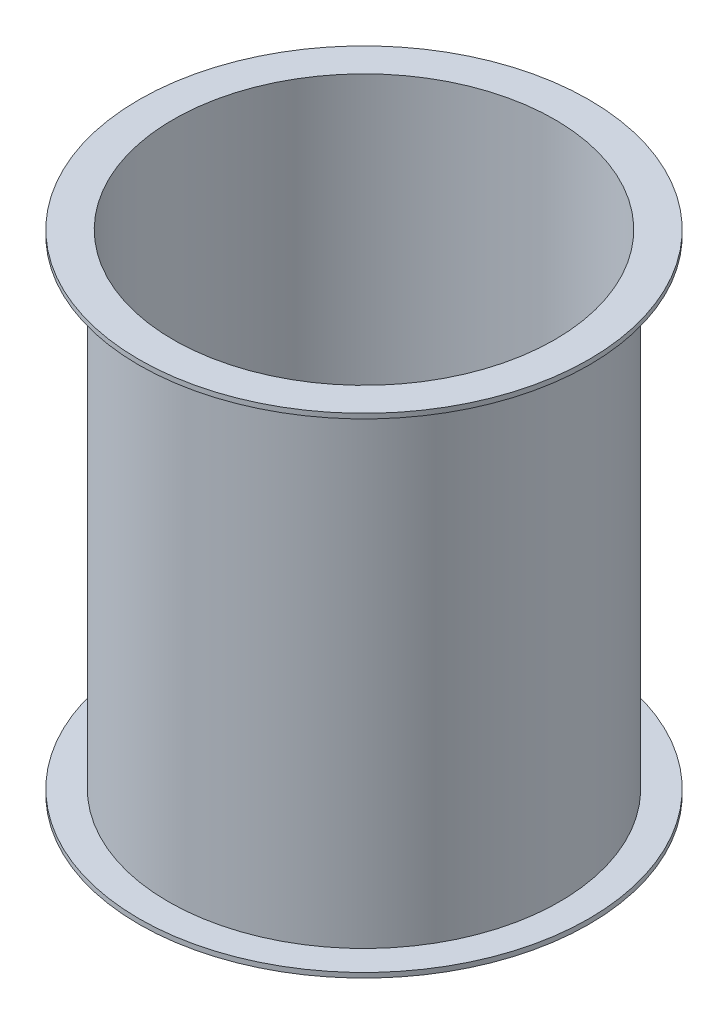
ISO-10303-21;
HEADER;
FILE_DESCRIPTION(('STEP AP214'),'2;1');
FILE_NAME('part.step','',(''),(''),'','','');
FILE_SCHEMA(('AUTOMOTIVE_DESIGN { 1 0 10303 214 1 1 1 1 }'));
ENDSEC;
DATA;
#1=APPLICATION_CONTEXT('core data for automotive mechanical design processes');
#2=APPLICATION_PROTOCOL_DEFINITION('international standard','automotive_design',2000,#1);
#3=PRODUCT_CONTEXT('',#1,'mechanical');
#4=PRODUCT('Part','Part','',(#3));
#5=PRODUCT_RELATED_PRODUCT_CATEGORY('part','',(#4));
#6=PRODUCT_DEFINITION_FORMATION('','',#4);
#7=PRODUCT_DEFINITION_CONTEXT('part definition',#1,'design');
#8=PRODUCT_DEFINITION('design','',#6,#7);
#9=PRODUCT_DEFINITION_SHAPE('','',#8);
#10=(LENGTH_UNIT() NAMED_UNIT(*) SI_UNIT(.MILLI.,.METRE.));
#11=(NAMED_UNIT(*) PLANE_ANGLE_UNIT() SI_UNIT($,.RADIAN.));
#12=(NAMED_UNIT(*) SI_UNIT($,.STERADIAN.) SOLID_ANGLE_UNIT());
#13=UNCERTAINTY_MEASURE_WITH_UNIT(LENGTH_MEASURE(1.E-05),#10,'distance_accuracy_value','');
#14=(GEOMETRIC_REPRESENTATION_CONTEXT(3) GLOBAL_UNCERTAINTY_ASSIGNED_CONTEXT((#13)) GLOBAL_UNIT_ASSIGNED_CONTEXT((#10,
#11,#12)) REPRESENTATION_CONTEXT('',''));
#15=CARTESIAN_POINT('',(0.,0.,0.));
#16=DIRECTION('',(0.,0.,1.));
#17=DIRECTION('',(1.,0.,0.));
#18=AXIS2_PLACEMENT_3D('',#15,#16,#17);
#19=CARTESIAN_POINT('',(0.,100.,0.));
#20=DIRECTION('',(0.,-1.,0.));
#21=DIRECTION('',(0.,0.,-1.));
#22=AXIS2_PLACEMENT_3D('',#19,#20,#21);
#23=CYLINDRICAL_SURFACE('',#22,40.);
#24=CARTESIAN_POINT('',(0.,99.,0.));
#25=DIRECTION('',(0.,1.,0.));
#26=DIRECTION('',(0.,0.,1.));
#27=AXIS2_PLACEMENT_3D('',#24,#25,#26);
#28=CIRCLE('',#27,40.);
#29=CARTESIAN_POINT('',(0.,99.,40.));
#30=VERTEX_POINT('',#29);
#31=EDGE_CURVE('E47',#30,#30,#28,.T.);
#32=ORIENTED_EDGE('',*,*,#31,.F.);
#33=EDGE_LOOP('',(#32));
#34=FACE_BOUND('',#33,.T.);
#35=CARTESIAN_POINT('',(0.,1.,0.));
#36=DIRECTION('',(0.,-1.,0.));
#37=DIRECTION('',(0.,0.,-1.));
#38=AXIS2_PLACEMENT_3D('',#35,#36,#37);
#39=CIRCLE('',#38,40.);
#40=CARTESIAN_POINT('',(0.,1.,-40.));
#41=VERTEX_POINT('',#40);
#42=EDGE_CURVE('E11',#41,#41,#39,.T.);
#43=ORIENTED_EDGE('',*,*,#42,.F.);
#44=EDGE_LOOP('',(#43));
#45=FACE_BOUND('',#44,.T.);
#46=ADVANCED_FACE('F41',(#34,#45),#23,.T.);
#47=CARTESIAN_POINT('',(0.,100.,0.));
#48=DIRECTION('',(0.,1.,0.));
#49=DIRECTION('',(0.,0.,1.));
#50=AXIS2_PLACEMENT_3D('',#47,#48,#49);
#51=PLANE('',#50);
#52=CARTESIAN_POINT('',(0.,100.,0.));
#53=DIRECTION('',(0.,1.,0.));
#54=DIRECTION('',(1.,0.,0.));
#55=AXIS2_PLACEMENT_3D('',#52,#53,#54);
#56=CIRCLE('',#55,39.);
#57=CARTESIAN_POINT('',(39.,100.,0.));
#58=VERTEX_POINT('',#57);
#59=EDGE_CURVE('E51',#58,#58,#56,.T.);
#60=ORIENTED_EDGE('',*,*,#59,.F.);
#61=EDGE_LOOP('',(#60));
#62=FACE_BOUND('',#61,.T.);
#63=CARTESIAN_POINT('',(0.,100.,0.));
#64=DIRECTION('',(0.,1.,0.));
#65=DIRECTION('',(0.,0.,1.));
#66=AXIS2_PLACEMENT_3D('',#63,#64,#65);
#67=CIRCLE('',#66,46.);
#68=CARTESIAN_POINT('',(0.,100.,46.));
#69=VERTEX_POINT('',#68);
#70=EDGE_CURVE('E61',#69,#69,#67,.T.);
#71=ORIENTED_EDGE('',*,*,#70,.T.);
#72=EDGE_LOOP('',(#71));
#73=FACE_BOUND('',#72,.T.);
#74=ADVANCED_FACE('F85',(#62,#73),#51,.T.);
#75=CARTESIAN_POINT('',(0.,0.,0.));
#76=DIRECTION('',(0.,1.,0.));
#77=DIRECTION('',(0.,0.,1.));
#78=AXIS2_PLACEMENT_3D('',#75,#76,#77);
#79=PLANE('',#78);
#80=CARTESIAN_POINT('',(0.,0.,0.));
#81=DIRECTION('',(0.,1.,0.));
#82=DIRECTION('',(1.,0.,0.));
#83=AXIS2_PLACEMENT_3D('',#80,#81,#82);
#84=CIRCLE('',#83,39.);
#85=CARTESIAN_POINT('',(39.,0.,0.));
#86=VERTEX_POINT('',#85);
#87=EDGE_CURVE('E55',#86,#86,#84,.T.);
#88=ORIENTED_EDGE('',*,*,#87,.T.);
#89=EDGE_LOOP('',(#88));
#90=FACE_BOUND('',#89,.T.);
#91=CARTESIAN_POINT('',(0.,0.,0.));
#92=DIRECTION('',(0.,-1.,0.));
#93=DIRECTION('',(0.,0.,-1.));
#94=AXIS2_PLACEMENT_3D('',#91,#92,#93);
#95=CIRCLE('',#94,46.);
#96=CARTESIAN_POINT('',(0.,0.,-46.));
#97=VERTEX_POINT('',#96);
#98=EDGE_CURVE('E67',#97,#97,#95,.T.);
#99=ORIENTED_EDGE('',*,*,#98,.T.);
#100=EDGE_LOOP('',(#99));
#101=FACE_BOUND('',#100,.T.);
#102=ADVANCED_FACE('F90',(#90,#101),#79,.F.);
#103=CARTESIAN_POINT('',(0.,100.,0.));
#104=DIRECTION('',(0.,-1.,0.));
#105=DIRECTION('',(0.,0.,-1.));
#106=AXIS2_PLACEMENT_3D('',#103,#104,#105);
#107=CYLINDRICAL_SURFACE('',#106,39.);
#108=ORIENTED_EDGE('',*,*,#59,.T.);
#109=EDGE_LOOP('',(#108));
#110=FACE_BOUND('',#109,.T.);
#111=ORIENTED_EDGE('',*,*,#87,.F.);
#112=EDGE_LOOP('',(#111));
#113=FACE_BOUND('',#112,.T.);
#114=ADVANCED_FACE('F97',(#110,#113),#107,.F.);
#115=CARTESIAN_POINT('',(0.,99.,0.));
#116=DIRECTION('',(0.,1.,0.));
#117=DIRECTION('',(0.,0.,1.));
#118=AXIS2_PLACEMENT_3D('',#115,#116,#117);
#119=CYLINDRICAL_SURFACE('',#118,46.);
#120=CARTESIAN_POINT('',(0.,99.,0.));
#121=DIRECTION('',(0.,1.,0.));
#122=DIRECTION('',(0.,0.,1.));
#123=AXIS2_PLACEMENT_3D('',#120,#121,#122);
#124=CIRCLE('',#123,46.);
#125=CARTESIAN_POINT('',(0.,99.,46.));
#126=VERTEX_POINT('',#125);
#127=EDGE_CURVE('E59',#126,#126,#124,.T.);
#128=ORIENTED_EDGE('',*,*,#127,.T.);
#129=EDGE_LOOP('',(#128));
#130=FACE_BOUND('',#129,.T.);
#131=ORIENTED_EDGE('',*,*,#70,.F.);
#132=EDGE_LOOP('',(#131));
#133=FACE_BOUND('',#132,.T.);
#134=ADVANCED_FACE('F104',(#130,#133),#119,.T.);
#135=CARTESIAN_POINT('',(0.,99.,0.));
#136=DIRECTION('',(0.,1.,0.));
#137=DIRECTION('',(0.,0.,1.));
#138=AXIS2_PLACEMENT_3D('',#135,#136,#137);
#139=PLANE('',#138);
#140=ORIENTED_EDGE('',*,*,#31,.T.);
#141=EDGE_LOOP('',(#140));
#142=FACE_BOUND('',#141,.T.);
#143=ORIENTED_EDGE('',*,*,#127,.F.);
#144=EDGE_LOOP('',(#143));
#145=FACE_BOUND('',#144,.T.);
#146=ADVANCED_FACE('F82',(#142,#145),#139,.F.);
#147=CARTESIAN_POINT('',(0.,1.,0.));
#148=DIRECTION('',(0.,-1.,0.));
#149=DIRECTION('',(0.,0.,-1.));
#150=AXIS2_PLACEMENT_3D('',#147,#148,#149);
#151=CYLINDRICAL_SURFACE('',#150,46.);
#152=CARTESIAN_POINT('',(0.,1.,0.));
#153=DIRECTION('',(0.,-1.,0.));
#154=DIRECTION('',(0.,0.,-1.));
#155=AXIS2_PLACEMENT_3D('',#152,#153,#154);
#156=CIRCLE('',#155,46.);
#157=CARTESIAN_POINT('',(0.,1.,-46.));
#158=VERTEX_POINT('',#157);
#159=EDGE_CURVE('E64',#158,#158,#156,.T.);
#160=ORIENTED_EDGE('',*,*,#159,.T.);
#161=EDGE_LOOP('',(#160));
#162=FACE_BOUND('',#161,.T.);
#163=ORIENTED_EDGE('',*,*,#98,.F.);
#164=EDGE_LOOP('',(#163));
#165=FACE_BOUND('',#164,.T.);
#166=ADVANCED_FACE('F73',(#162,#165),#151,.T.);
#167=CARTESIAN_POINT('',(0.,1.,0.));
#168=DIRECTION('',(0.,-1.,0.));
#169=DIRECTION('',(0.,0.,-1.));
#170=AXIS2_PLACEMENT_3D('',#167,#168,#169);
#171=PLANE('',#170);
#172=ORIENTED_EDGE('',*,*,#42,.T.);
#173=EDGE_LOOP('',(#172));
#174=FACE_BOUND('',#173,.T.);
#175=ORIENTED_EDGE('',*,*,#159,.F.);
#176=EDGE_LOOP('',(#175));
#177=FACE_BOUND('',#176,.T.);
#178=ADVANCED_FACE('F76',(#174,#177),#171,.F.);
#179=CLOSED_SHELL('',(#46,#74,#102,#114,#134,#146,#166,#178));
#180=MANIFOLD_SOLID_BREP('B2',#179);
#181=ADVANCED_BREP_SHAPE_REPRESENTATION('',(#18,#180),#14);
#182=SHAPE_DEFINITION_REPRESENTATION(#9,#181);
ENDSEC;
END-ISO-10303-21;
